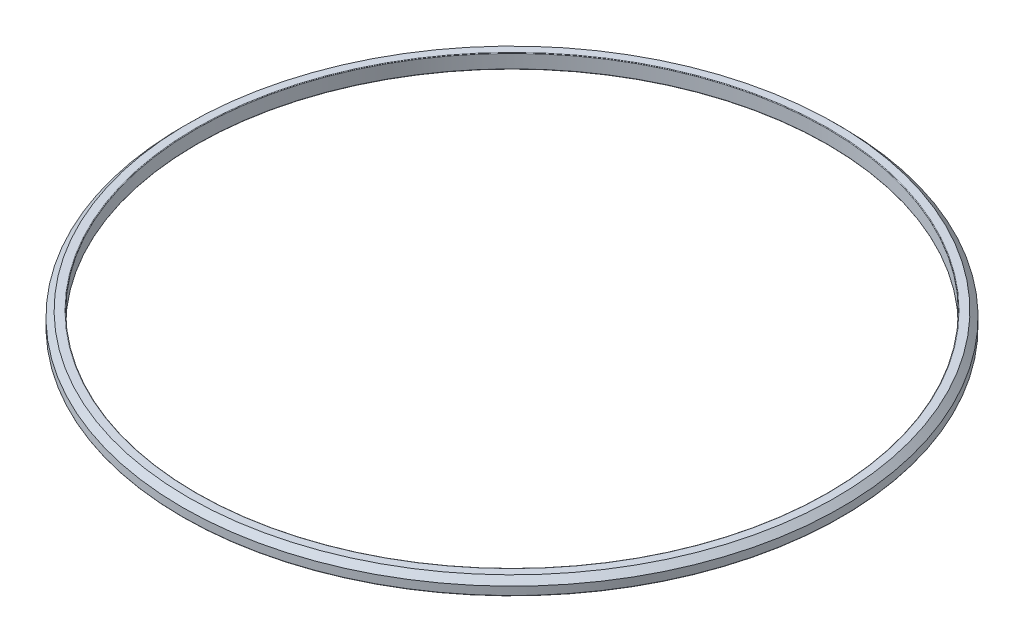
ISO-10303-21;
HEADER;
FILE_DESCRIPTION(('STEP AP214'),'2;1');
FILE_NAME('part.step','',(''),(''),'','','');
FILE_SCHEMA(('AUTOMOTIVE_DESIGN { 1 0 10303 214 1 1 1 1 }'));
ENDSEC;
DATA;
#1=APPLICATION_CONTEXT('core data for automotive mechanical design processes');
#2=APPLICATION_PROTOCOL_DEFINITION('international standard','automotive_design',2000,#1);
#3=PRODUCT_CONTEXT('',#1,'mechanical');
#4=PRODUCT('Part','Part','',(#3));
#5=PRODUCT_RELATED_PRODUCT_CATEGORY('part','',(#4));
#6=PRODUCT_DEFINITION_FORMATION('','',#4);
#7=PRODUCT_DEFINITION_CONTEXT('part definition',#1,'design');
#8=PRODUCT_DEFINITION('design','',#6,#7);
#9=PRODUCT_DEFINITION_SHAPE('','',#8);
#10=(LENGTH_UNIT() NAMED_UNIT(*) SI_UNIT(.MILLI.,.METRE.));
#11=(NAMED_UNIT(*) PLANE_ANGLE_UNIT() SI_UNIT($,.RADIAN.));
#12=(NAMED_UNIT(*) SI_UNIT($,.STERADIAN.) SOLID_ANGLE_UNIT());
#13=UNCERTAINTY_MEASURE_WITH_UNIT(LENGTH_MEASURE(1.E-05),#10,'distance_accuracy_value','');
#14=(GEOMETRIC_REPRESENTATION_CONTEXT(3) GLOBAL_UNCERTAINTY_ASSIGNED_CONTEXT((#13)) GLOBAL_UNIT_ASSIGNED_CONTEXT((#10,
#11,#12)) REPRESENTATION_CONTEXT('',''));
#15=CARTESIAN_POINT('',(0.,0.,0.));
#16=DIRECTION('',(0.,0.,1.));
#17=DIRECTION('',(1.,0.,0.));
#18=AXIS2_PLACEMENT_3D('',#15,#16,#17);
#19=CARTESIAN_POINT('',(0.,2.5,0.));
#20=DIRECTION('',(0.,1.,0.));
#21=DIRECTION('',(0.,0.,1.));
#22=AXIS2_PLACEMENT_3D('',#19,#20,#21);
#23=PLANE('',#22);
#24=CARTESIAN_POINT('',(0.,2.5,0.));
#25=DIRECTION('',(0.,1.,0.));
#26=DIRECTION('',(0.,0.,1.));
#27=AXIS2_PLACEMENT_3D('',#24,#25,#26);
#28=CIRCLE('',#27,54.8875);
#29=CARTESIAN_POINT('',(0.,2.5,54.8875));
#30=VERTEX_POINT('',#29);
#31=EDGE_CURVE('E49',#30,#30,#28,.F.);
#32=ORIENTED_EDGE('',*,*,#31,.T.);
#33=EDGE_LOOP('',(#32));
#34=FACE_BOUND('',#33,.T.);
#35=CARTESIAN_POINT('',(0.,2.5,0.));
#36=DIRECTION('',(0.,1.,0.));
#37=DIRECTION('',(0.,0.,1.));
#38=AXIS2_PLACEMENT_3D('',#35,#36,#37);
#39=CIRCLE('',#38,56.2125);
#40=CARTESIAN_POINT('',(0.,2.5,56.2125));
#41=VERTEX_POINT('',#40);
#42=EDGE_CURVE('E63',#41,#41,#39,.T.);
#43=ORIENTED_EDGE('',*,*,#42,.T.);
#44=EDGE_LOOP('',(#43));
#45=FACE_BOUND('',#44,.T.);
#46=ADVANCED_FACE('F34',(#34,#45),#23,.T.);
#47=CARTESIAN_POINT('',(0.,0.,0.));
#48=DIRECTION('',(0.,1.,0.));
#49=DIRECTION('',(0.,0.,1.));
#50=AXIS2_PLACEMENT_3D('',#47,#48,#49);
#51=PLANE('',#50);
#52=CARTESIAN_POINT('',(0.,0.,0.));
#53=DIRECTION('',(0.,1.,0.));
#54=DIRECTION('',(0.,0.,1.));
#55=AXIS2_PLACEMENT_3D('',#52,#53,#54);
#56=CIRCLE('',#55,54.8875);
#57=CARTESIAN_POINT('',(0.,0.,54.8875));
#58=VERTEX_POINT('',#57);
#59=EDGE_CURVE('E41',#58,#58,#56,.T.);
#60=ORIENTED_EDGE('',*,*,#59,.T.);
#61=EDGE_LOOP('',(#60));
#62=FACE_BOUND('',#61,.T.);
#63=CARTESIAN_POINT('',(0.,0.,0.));
#64=DIRECTION('',(0.,1.,0.));
#65=DIRECTION('',(0.,0.,1.));
#66=AXIS2_PLACEMENT_3D('',#63,#64,#65);
#67=CIRCLE('',#66,57.1125);
#68=CARTESIAN_POINT('',(0.,0.,57.1125));
#69=VERTEX_POINT('',#68);
#70=EDGE_CURVE('E45',#69,#69,#67,.F.);
#71=ORIENTED_EDGE('',*,*,#70,.T.);
#72=EDGE_LOOP('',(#71));
#73=FACE_BOUND('',#72,.T.);
#74=ADVANCED_FACE('F89',(#62,#73),#51,.F.);
#75=CARTESIAN_POINT('',(0.,2.5,0.));
#76=DIRECTION('',(0.,-1.,0.));
#77=DIRECTION('',(0.,0.,-1.));
#78=AXIS2_PLACEMENT_3D('',#75,#76,#77);
#79=CYLINDRICAL_SURFACE('',#78,57.2125);
#80=CARTESIAN_POINT('',(0.,0.0999999999999998,0.));
#81=DIRECTION('',(0.,1.,0.));
#82=DIRECTION('',(0.,0.,1.));
#83=AXIS2_PLACEMENT_3D('',#80,#81,#82);
#84=CIRCLE('',#83,57.2125);
#85=CARTESIAN_POINT('',(0.,0.0999999999999998,57.2125));
#86=VERTEX_POINT('',#85);
#87=EDGE_CURVE('E10',#86,#86,#84,.T.);
#88=ORIENTED_EDGE('',*,*,#87,.T.);
#89=EDGE_LOOP('',(#88));
#90=FACE_BOUND('',#89,.T.);
#91=CARTESIAN_POINT('',(0.,1.49999999999996,0.));
#92=DIRECTION('',(0.,1.,0.));
#93=DIRECTION('',(0.,0.,1.));
#94=AXIS2_PLACEMENT_3D('',#91,#92,#93);
#95=CIRCLE('',#94,57.2125);
#96=CARTESIAN_POINT('',(0.,1.49999999999996,57.2125));
#97=VERTEX_POINT('',#96);
#98=EDGE_CURVE('E60',#97,#97,#95,.F.);
#99=ORIENTED_EDGE('',*,*,#98,.T.);
#100=EDGE_LOOP('',(#99));
#101=FACE_BOUND('',#100,.T.);
#102=ADVANCED_FACE('F82',(#90,#101),#79,.T.);
#103=CARTESIAN_POINT('',(0.,2.5,0.));
#104=DIRECTION('',(0.,-1.,0.));
#105=DIRECTION('',(0.,0.,-1.));
#106=AXIS2_PLACEMENT_3D('',#103,#104,#105);
#107=CYLINDRICAL_SURFACE('',#106,54.7875);
#108=CARTESIAN_POINT('',(0.,2.4,0.));
#109=DIRECTION('',(0.,1.,0.));
#110=DIRECTION('',(0.,0.,1.));
#111=AXIS2_PLACEMENT_3D('',#108,#109,#110);
#112=CIRCLE('',#111,54.7875);
#113=CARTESIAN_POINT('',(0.,2.4,54.7875));
#114=VERTEX_POINT('',#113);
#115=EDGE_CURVE('E54',#114,#114,#112,.T.);
#116=ORIENTED_EDGE('',*,*,#115,.T.);
#117=EDGE_LOOP('',(#116));
#118=FACE_BOUND('',#117,.T.);
#119=CARTESIAN_POINT('',(0.,0.0999999999999998,0.));
#120=DIRECTION('',(0.,1.,0.));
#121=DIRECTION('',(0.,0.,1.));
#122=AXIS2_PLACEMENT_3D('',#119,#120,#121);
#123=CIRCLE('',#122,54.7875);
#124=CARTESIAN_POINT('',(0.,0.0999999999999998,54.7875));
#125=VERTEX_POINT('',#124);
#126=EDGE_CURVE('E57',#125,#125,#123,.F.);
#127=ORIENTED_EDGE('',*,*,#126,.T.);
#128=EDGE_LOOP('',(#127));
#129=FACE_BOUND('',#128,.T.);
#130=ADVANCED_FACE('F71',(#118,#129),#107,.F.);
#131=CARTESIAN_POINT('',(0.,2.5,0.));
#132=DIRECTION('',(0.,-1.,0.));
#133=DIRECTION('',(0.,0.,-1.));
#134=AXIS2_PLACEMENT_3D('',#131,#132,#133);
#135=CONICAL_SURFACE('',#134,56.2125,0.785398163397445);
#136=ORIENTED_EDGE('',*,*,#98,.F.);
#137=EDGE_LOOP('',(#136));
#138=FACE_BOUND('',#137,.T.);
#139=ORIENTED_EDGE('',*,*,#42,.F.);
#140=EDGE_LOOP('',(#139));
#141=FACE_BOUND('',#140,.T.);
#142=ADVANCED_FACE('F68',(#138,#141),#135,.T.);
#143=CARTESIAN_POINT('',(0.,2.4,0.));
#144=DIRECTION('',(0.,1.,0.));
#145=DIRECTION('',(0.,0.,1.));
#146=AXIS2_PLACEMENT_3D('',#143,#144,#145);
#147=TOROIDAL_SURFACE('',#146,54.8875,0.1);
#148=ORIENTED_EDGE('',*,*,#31,.F.);
#149=EDGE_LOOP('',(#148));
#150=FACE_BOUND('',#149,.T.);
#151=ORIENTED_EDGE('',*,*,#115,.F.);
#152=EDGE_LOOP('',(#151));
#153=FACE_BOUND('',#152,.T.);
#154=ADVANCED_FACE('F70',(#150,#153),#147,.T.);
#155=CARTESIAN_POINT('',(0.,0.0999999999999998,0.));
#156=DIRECTION('',(0.,1.,0.));
#157=DIRECTION('',(0.,0.,1.));
#158=AXIS2_PLACEMENT_3D('',#155,#156,#157);
#159=TOROIDAL_SURFACE('',#158,54.8875,0.1);
#160=ORIENTED_EDGE('',*,*,#126,.F.);
#161=EDGE_LOOP('',(#160));
#162=FACE_BOUND('',#161,.T.);
#163=ORIENTED_EDGE('',*,*,#59,.F.);
#164=EDGE_LOOP('',(#163));
#165=FACE_BOUND('',#164,.T.);
#166=ADVANCED_FACE('F78',(#162,#165),#159,.T.);
#167=CARTESIAN_POINT('',(0.,0.0999999999999998,0.));
#168=DIRECTION('',(0.,1.,0.));
#169=DIRECTION('',(0.,0.,1.));
#170=AXIS2_PLACEMENT_3D('',#167,#168,#169);
#171=TOROIDAL_SURFACE('',#170,57.1125,0.1);
#172=ORIENTED_EDGE('',*,*,#70,.F.);
#173=EDGE_LOOP('',(#172));
#174=FACE_BOUND('',#173,.T.);
#175=ORIENTED_EDGE('',*,*,#87,.F.);
#176=EDGE_LOOP('',(#175));
#177=FACE_BOUND('',#176,.T.);
#178=ADVANCED_FACE('F36',(#174,#177),#171,.T.);
#179=CLOSED_SHELL('',(#46,#74,#102,#130,#142,#154,#166,#178));
#180=MANIFOLD_SOLID_BREP('B2',#179);
#181=ADVANCED_BREP_SHAPE_REPRESENTATION('',(#18,#180),#14);
#182=SHAPE_DEFINITION_REPRESENTATION(#9,#181);
ENDSEC;
END-ISO-10303-21;
